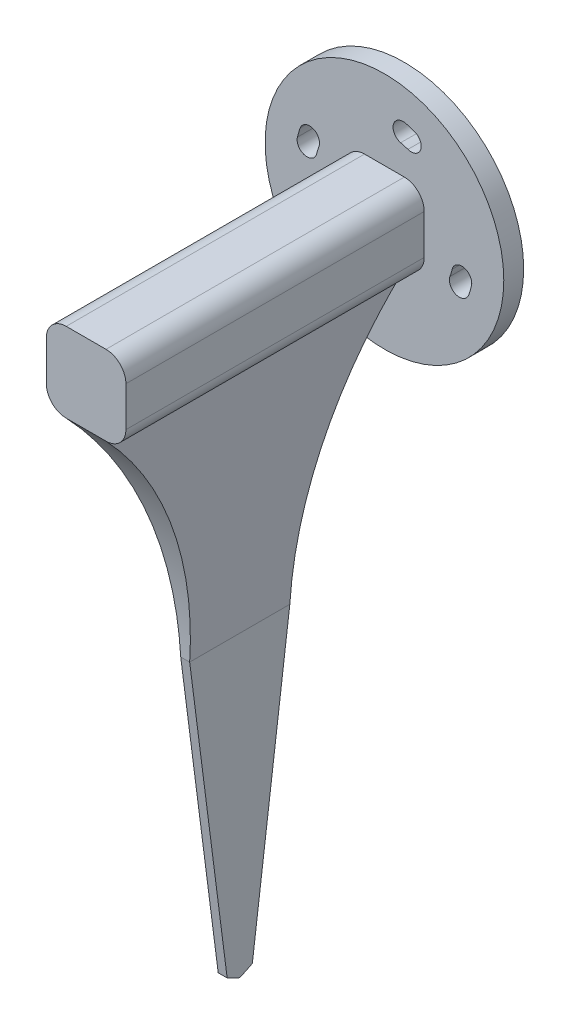
ISO-10303-21;
HEADER;
FILE_DESCRIPTION(('STEP AP214'),'2;1');
FILE_NAME('part.step','',(''),(''),'','','');
FILE_SCHEMA(('AUTOMOTIVE_DESIGN { 1 0 10303 214 1 1 1 1 }'));
ENDSEC;
DATA;
#1=APPLICATION_CONTEXT('core data for automotive mechanical design processes');
#2=APPLICATION_PROTOCOL_DEFINITION('international standard','automotive_design',2000,#1);
#3=PRODUCT_CONTEXT('',#1,'mechanical');
#4=PRODUCT('Part','Part','',(#3));
#5=PRODUCT_RELATED_PRODUCT_CATEGORY('part','',(#4));
#6=PRODUCT_DEFINITION_FORMATION('','',#4);
#7=PRODUCT_DEFINITION_CONTEXT('part definition',#1,'design');
#8=PRODUCT_DEFINITION('design','',#6,#7);
#9=PRODUCT_DEFINITION_SHAPE('','',#8);
#10=(LENGTH_UNIT() NAMED_UNIT(*) SI_UNIT(.MILLI.,.METRE.));
#11=(NAMED_UNIT(*) PLANE_ANGLE_UNIT() SI_UNIT($,.RADIAN.));
#12=(NAMED_UNIT(*) SI_UNIT($,.STERADIAN.) SOLID_ANGLE_UNIT());
#13=UNCERTAINTY_MEASURE_WITH_UNIT(LENGTH_MEASURE(1.E-05),#10,'distance_accuracy_value','');
#14=(GEOMETRIC_REPRESENTATION_CONTEXT(3) GLOBAL_UNCERTAINTY_ASSIGNED_CONTEXT((#13)) GLOBAL_UNIT_ASSIGNED_CONTEXT((#10,
#11,#12)) REPRESENTATION_CONTEXT('',''));
#15=CARTESIAN_POINT('',(0.,0.,0.));
#16=DIRECTION('',(0.,0.,1.));
#17=DIRECTION('',(1.,0.,0.));
#18=AXIS2_PLACEMENT_3D('',#15,#16,#17);
#19=CARTESIAN_POINT('',(0.,0.,2.));
#20=DIRECTION('',(0.,0.,1.));
#21=DIRECTION('',(1.,0.,0.));
#22=AXIS2_PLACEMENT_3D('',#19,#20,#21);
#23=PLANE('',#22);
#24=CARTESIAN_POINT('',(-2.69636700793075,-7.53190579857068,2.));
#25=DIRECTION('',(0.,0.,1.));
#26=DIRECTION('',(1.,0.,0.));
#27=AXIS2_PLACEMENT_3D('',#24,#25,#26);
#28=CIRCLE('',#27,0.999999999999998);
#29=CARTESIAN_POINT('',(-2.3593211319394,-6.59041757374934,2.));
#30=VERTEX_POINT('',#29);
#31=CARTESIAN_POINT('',(-3.0334128839221,-8.47339402339201,2.));
#32=VERTEX_POINT('',#31);
#33=EDGE_CURVE('E253',#30,#32,#28,.T.);
#34=ORIENTED_EDGE('',*,*,#33,.F.);
#35=CARTESIAN_POINT('',(0.,0.,2.));
#36=DIRECTION('',(0.,0.,1.));
#37=DIRECTION('',(1.,0.,0.));
#38=AXIS2_PLACEMENT_3D('',#35,#36,#37);
#39=CIRCLE('',#38,6.99999999999998);
#40=CARTESIAN_POINT('',(-1.63399074995166,-6.80661988281059,2.));
#41=VERTEX_POINT('',#40);
#42=EDGE_CURVE('E565',#30,#41,#39,.T.);
#43=ORIENTED_EDGE('',*,*,#42,.T.);
#44=CARTESIAN_POINT('',(-1.86741799994476,-7.77899415178353,2.));
#45=DIRECTION('',(0.,0.,1.));
#46=DIRECTION('',(1.,0.,0.));
#47=AXIS2_PLACEMENT_3D('',#44,#45,#46);
#48=CIRCLE('',#47,1.);
#49=CARTESIAN_POINT('',(-2.10084524993786,-8.75136842075647,2.));
#50=VERTEX_POINT('',#49);
#51=EDGE_CURVE('E561',#50,#41,#48,.T.);
#52=ORIENTED_EDGE('',*,*,#51,.F.);
#53=CARTESIAN_POINT('',(0.,0.,2.));
#54=DIRECTION('',(0.,0.,1.));
#55=DIRECTION('',(1.,0.,0.));
#56=AXIS2_PLACEMENT_3D('',#53,#54,#55);
#57=CIRCLE('',#56,8.99999999999997);
#58=EDGE_CURVE('E564',#32,#50,#57,.T.);
#59=ORIENTED_EDGE('',*,*,#58,.F.);
#60=EDGE_LOOP('',(#34,#43,#52,#59));
#61=FACE_BOUND('',#60,.T.);
#62=CARTESIAN_POINT('',(-7.53190579857068,2.69636700793075,2.));
#63=DIRECTION('',(0.,0.,1.));
#64=DIRECTION('',(1.,0.,0.));
#65=AXIS2_PLACEMENT_3D('',#62,#63,#64);
#66=CIRCLE('',#65,1.);
#67=CARTESIAN_POINT('',(-6.59041757374934,2.3593211319394,2.));
#68=VERTEX_POINT('',#67);
#69=CARTESIAN_POINT('',(-8.47339402339201,3.03341288392209,2.));
#70=VERTEX_POINT('',#69);
#71=EDGE_CURVE('E567',#68,#70,#66,.T.);
#72=ORIENTED_EDGE('',*,*,#71,.F.);
#73=CARTESIAN_POINT('',(0.,0.,2.));
#74=DIRECTION('',(0.,0.,1.));
#75=DIRECTION('',(1.,0.,0.));
#76=AXIS2_PLACEMENT_3D('',#73,#74,#75);
#77=CIRCLE('',#76,7.00000000000005);
#78=CARTESIAN_POINT('',(-6.80661988281061,1.63399074995159,2.));
#79=VERTEX_POINT('',#78);
#80=EDGE_CURVE('E574',#68,#79,#77,.T.);
#81=ORIENTED_EDGE('',*,*,#80,.T.);
#82=CARTESIAN_POINT('',(-7.77899415178355,1.86741799994468,2.));
#83=DIRECTION('',(0.,0.,1.));
#84=DIRECTION('',(1.,0.,0.));
#85=AXIS2_PLACEMENT_3D('',#82,#83,#84);
#86=CIRCLE('',#85,1.);
#87=CARTESIAN_POINT('',(-8.75136842075649,2.10084524993776,2.));
#88=VERTEX_POINT('',#87);
#89=EDGE_CURVE('E576',#88,#79,#86,.T.);
#90=ORIENTED_EDGE('',*,*,#89,.F.);
#91=CARTESIAN_POINT('',(0.,0.,2.));
#92=DIRECTION('',(0.,0.,1.));
#93=DIRECTION('',(1.,0.,0.));
#94=AXIS2_PLACEMENT_3D('',#91,#92,#93);
#95=CIRCLE('',#94,9.00000000000005);
#96=EDGE_CURVE('E579',#70,#88,#95,.T.);
#97=ORIENTED_EDGE('',*,*,#96,.F.);
#98=EDGE_LOOP('',(#72,#81,#90,#97));
#99=FACE_BOUND('',#98,.T.);
#100=CARTESIAN_POINT('',(2.69636700793075,7.53190579857068,2.));
#101=DIRECTION('',(0.,0.,1.));
#102=DIRECTION('',(1.,0.,0.));
#103=AXIS2_PLACEMENT_3D('',#100,#101,#102);
#104=CIRCLE('',#103,1.);
#105=CARTESIAN_POINT('',(2.3593211319394,6.59041757374935,2.));
#106=VERTEX_POINT('',#105);
#107=CARTESIAN_POINT('',(3.03341288392209,8.47339402339202,2.));
#108=VERTEX_POINT('',#107);
#109=EDGE_CURVE('E582',#106,#108,#104,.T.);
#110=ORIENTED_EDGE('',*,*,#109,.F.);
#111=CARTESIAN_POINT('',(0.,0.,2.));
#112=DIRECTION('',(0.,0.,1.));
#113=DIRECTION('',(1.,0.,0.));
#114=AXIS2_PLACEMENT_3D('',#111,#112,#113);
#115=CIRCLE('',#114,7.00000000000002);
#116=CARTESIAN_POINT('',(1.63399074995162,6.8066198828106,2.));
#117=VERTEX_POINT('',#116);
#118=EDGE_CURVE('E585',#106,#117,#115,.T.);
#119=ORIENTED_EDGE('',*,*,#118,.T.);
#120=CARTESIAN_POINT('',(1.8674179999447,7.77899415178354,2.));
#121=DIRECTION('',(0.,0.,1.));
#122=DIRECTION('',(1.,0.,0.));
#123=AXIS2_PLACEMENT_3D('',#120,#121,#122);
#124=CIRCLE('',#123,1.);
#125=CARTESIAN_POINT('',(2.10084524993779,8.75136842075649,2.));
#126=VERTEX_POINT('',#125);
#127=EDGE_CURVE('E587',#126,#117,#124,.T.);
#128=ORIENTED_EDGE('',*,*,#127,.F.);
#129=CARTESIAN_POINT('',(0.,0.,2.));
#130=DIRECTION('',(0.,0.,1.));
#131=DIRECTION('',(1.,0.,0.));
#132=AXIS2_PLACEMENT_3D('',#129,#130,#131);
#133=CIRCLE('',#132,9.00000000000003);
#134=EDGE_CURVE('E590',#108,#126,#133,.T.);
#135=ORIENTED_EDGE('',*,*,#134,.F.);
#136=EDGE_LOOP('',(#110,#119,#128,#135));
#137=FACE_BOUND('',#136,.T.);
#138=CARTESIAN_POINT('',(0.,0.,2.));
#139=DIRECTION('',(0.,0.,1.));
#140=DIRECTION('',(1.,0.,0.));
#141=AXIS2_PLACEMENT_3D('',#138,#139,#140);
#142=CIRCLE('',#141,6.99999999999996);
#143=CARTESIAN_POINT('',(6.59041757374934,-2.35932113193941,2.));
#144=VERTEX_POINT('',#143);
#145=CARTESIAN_POINT('',(6.80661988281059,-1.63399074995164,2.));
#146=VERTEX_POINT('',#145);
#147=EDGE_CURVE('E192',#144,#146,#142,.T.);
#148=ORIENTED_EDGE('',*,*,#147,.T.);
#149=CARTESIAN_POINT('',(7.77899415178354,-1.86741799994473,2.));
#150=DIRECTION('',(0.,0.,1.));
#151=DIRECTION('',(1.,0.,0.));
#152=AXIS2_PLACEMENT_3D('',#149,#150,#151);
#153=CIRCLE('',#152,1.);
#154=CARTESIAN_POINT('',(8.75136842075648,-2.10084524993783,2.));
#155=VERTEX_POINT('',#154);
#156=EDGE_CURVE('E178',#155,#146,#153,.T.);
#157=ORIENTED_EDGE('',*,*,#156,.F.);
#158=CARTESIAN_POINT('',(0.,0.,2.));
#159=DIRECTION('',(0.,0.,1.));
#160=DIRECTION('',(1.,0.,0.));
#161=AXIS2_PLACEMENT_3D('',#158,#159,#160);
#162=CIRCLE('',#161,8.99999999999996);
#163=CARTESIAN_POINT('',(8.47339402339202,-3.03341288392209,2.));
#164=VERTEX_POINT('',#163);
#165=EDGE_CURVE('E191',#164,#155,#162,.T.);
#166=ORIENTED_EDGE('',*,*,#165,.F.);
#167=CARTESIAN_POINT('',(7.53190579857068,-2.69636700793075,2.));
#168=DIRECTION('',(0.,0.,1.));
#169=DIRECTION('',(1.,0.,0.));
#170=AXIS2_PLACEMENT_3D('',#167,#168,#169);
#171=CIRCLE('',#170,1.);
#172=EDGE_CURVE('E196',#144,#164,#171,.T.);
#173=ORIENTED_EDGE('',*,*,#172,.F.);
#174=EDGE_LOOP('',(#148,#157,#166,#173));
#175=FACE_BOUND('',#174,.T.);
#176=CARTESIAN_POINT('',(0.,0.,2.));
#177=DIRECTION('',(0.,0.,1.));
#178=DIRECTION('',(1.,0.,0.));
#179=AXIS2_PLACEMENT_3D('',#176,#177,#178);
#180=CIRCLE('',#179,12.);
#181=CARTESIAN_POINT('',(12.,0.,2.));
#182=VERTEX_POINT('',#181);
#183=EDGE_CURVE('E198',#182,#182,#180,.T.);
#184=ORIENTED_EDGE('',*,*,#183,.T.);
#185=EDGE_LOOP('',(#184));
#186=FACE_BOUND('',#185,.T.);
#187=DIRECTION('',(1.,0.,0.));
#188=VECTOR('',#187,1.);
#189=CARTESIAN_POINT('',(0.,-4.,2.));
#190=LINE('',#189,#188);
#191=CARTESIAN_POINT('',(-2.,-4.,2.));
#192=VERTEX_POINT('',#191);
#193=CARTESIAN_POINT('',(2.,-4.,2.));
#194=VERTEX_POINT('',#193);
#195=EDGE_CURVE('E290',#192,#194,#190,.T.);
#196=ORIENTED_EDGE('',*,*,#195,.F.);
#197=CARTESIAN_POINT('',(-2.,-2.,2.));
#198=DIRECTION('',(0.,0.,1.));
#199=DIRECTION('',(1.,0.,0.));
#200=AXIS2_PLACEMENT_3D('',#197,#198,#199);
#201=CIRCLE('',#200,2.);
#202=CARTESIAN_POINT('',(-4.,-2.,2.));
#203=VERTEX_POINT('',#202);
#204=EDGE_CURVE('E287',#203,#192,#201,.T.);
#205=ORIENTED_EDGE('',*,*,#204,.F.);
#206=DIRECTION('',(0.,-1.,0.));
#207=VECTOR('',#206,1.);
#208=CARTESIAN_POINT('',(-4.,2.,2.));
#209=LINE('',#208,#207);
#210=CARTESIAN_POINT('',(-4.,2.,2.));
#211=VERTEX_POINT('',#210);
#212=EDGE_CURVE('E286',#211,#203,#209,.T.);
#213=ORIENTED_EDGE('',*,*,#212,.F.);
#214=CARTESIAN_POINT('',(-2.,2.,2.));
#215=DIRECTION('',(0.,0.,1.));
#216=DIRECTION('',(1.,0.,0.));
#217=AXIS2_PLACEMENT_3D('',#214,#215,#216);
#218=CIRCLE('',#217,2.);
#219=CARTESIAN_POINT('',(-2.,4.,2.));
#220=VERTEX_POINT('',#219);
#221=EDGE_CURVE('E635',#220,#211,#218,.T.);
#222=ORIENTED_EDGE('',*,*,#221,.F.);
#223=DIRECTION('',(-1.,0.,0.));
#224=VECTOR('',#223,1.);
#225=CARTESIAN_POINT('',(-2.,4.,2.));
#226=LINE('',#225,#224);
#227=CARTESIAN_POINT('',(2.,4.,2.));
#228=VERTEX_POINT('',#227);
#229=EDGE_CURVE('E637',#228,#220,#226,.T.);
#230=ORIENTED_EDGE('',*,*,#229,.F.);
#231=CARTESIAN_POINT('',(2.,2.,2.));
#232=DIRECTION('',(0.,0.,1.));
#233=DIRECTION('',(-1.,0.,0.));
#234=AXIS2_PLACEMENT_3D('',#231,#232,#233);
#235=CIRCLE('',#234,2.);
#236=CARTESIAN_POINT('',(4.,2.,2.));
#237=VERTEX_POINT('',#236);
#238=EDGE_CURVE('E640',#237,#228,#235,.T.);
#239=ORIENTED_EDGE('',*,*,#238,.F.);
#240=DIRECTION('',(0.,1.,0.));
#241=VECTOR('',#240,1.);
#242=CARTESIAN_POINT('',(4.,2.,2.));
#243=LINE('',#242,#241);
#244=CARTESIAN_POINT('',(4.,-2.,2.));
#245=VERTEX_POINT('',#244);
#246=EDGE_CURVE('E295',#245,#237,#243,.T.);
#247=ORIENTED_EDGE('',*,*,#246,.F.);
#248=CARTESIAN_POINT('',(2.,-2.,2.));
#249=DIRECTION('',(0.,0.,1.));
#250=DIRECTION('',(1.,0.,0.));
#251=AXIS2_PLACEMENT_3D('',#248,#249,#250);
#252=CIRCLE('',#251,2.);
#253=EDGE_CURVE('E292',#194,#245,#252,.T.);
#254=ORIENTED_EDGE('',*,*,#253,.F.);
#255=EDGE_LOOP('',(#196,#205,#213,#222,#230,#239,#247,#254));
#256=FACE_BOUND('',#255,.T.);
#257=ADVANCED_FACE('F43',(#61,#99,#137,#175,#186,#256),#23,.T.);
#258=CARTESIAN_POINT('',(0.,0.,2.));
#259=DIRECTION('',(0.,0.,-1.));
#260=DIRECTION('',(-1.,0.,0.));
#261=AXIS2_PLACEMENT_3D('',#258,#259,#260);
#262=CYLINDRICAL_SURFACE('',#261,6.99999999999996);
#263=CARTESIAN_POINT('',(0.,0.,0.));
#264=DIRECTION('',(0.,0.,1.));
#265=DIRECTION('',(1.,0.,0.));
#266=AXIS2_PLACEMENT_3D('',#263,#264,#265);
#267=CIRCLE('',#266,6.99999999999996);
#268=CARTESIAN_POINT('',(6.59041757374934,-2.35932113193941,0.));
#269=VERTEX_POINT('',#268);
#270=CARTESIAN_POINT('',(6.80661988281059,-1.63399074995164,0.));
#271=VERTEX_POINT('',#270);
#272=EDGE_CURVE('E242',#269,#271,#267,.T.);
#273=ORIENTED_EDGE('',*,*,#272,.T.);
#274=DIRECTION('',(0.,0.,-1.));
#275=VECTOR('',#274,1.);
#276=CARTESIAN_POINT('',(6.80661988281059,-1.63399074995164,2.));
#277=LINE('',#276,#275);
#278=EDGE_CURVE('E12',#146,#271,#277,.T.);
#279=ORIENTED_EDGE('',*,*,#278,.F.);
#280=ORIENTED_EDGE('',*,*,#147,.F.);
#281=DIRECTION('',(0.,0.,-1.));
#282=VECTOR('',#281,1.);
#283=CARTESIAN_POINT('',(6.59041757374934,-2.35932113193941,2.));
#284=LINE('',#283,#282);
#285=EDGE_CURVE('E70',#144,#269,#284,.T.);
#286=ORIENTED_EDGE('',*,*,#285,.T.);
#287=EDGE_LOOP('',(#273,#279,#280,#286));
#288=FACE_BOUND('',#287,.T.);
#289=ADVANCED_FACE('F491',(#288),#262,.T.);
#290=CARTESIAN_POINT('',(7.77899415178354,-1.86741799994473,2.));
#291=DIRECTION('',(0.,0.,-1.));
#292=DIRECTION('',(-1.,0.,0.));
#293=AXIS2_PLACEMENT_3D('',#290,#291,#292);
#294=CYLINDRICAL_SURFACE('',#293,1.);
#295=CARTESIAN_POINT('',(7.77899415178354,-1.86741799994473,0.));
#296=DIRECTION('',(0.,0.,1.));
#297=DIRECTION('',(1.,0.,0.));
#298=AXIS2_PLACEMENT_3D('',#295,#296,#297);
#299=CIRCLE('',#298,1.);
#300=CARTESIAN_POINT('',(8.75136842075648,-2.10084524993783,0.));
#301=VERTEX_POINT('',#300);
#302=EDGE_CURVE('E180',#301,#271,#299,.T.);
#303=ORIENTED_EDGE('',*,*,#302,.F.);
#304=DIRECTION('',(0.,0.,-1.));
#305=VECTOR('',#304,1.);
#306=CARTESIAN_POINT('',(8.75136842075648,-2.10084524993783,2.));
#307=LINE('',#306,#305);
#308=EDGE_CURVE('E53',#155,#301,#307,.T.);
#309=ORIENTED_EDGE('',*,*,#308,.F.);
#310=ORIENTED_EDGE('',*,*,#156,.T.);
#311=ORIENTED_EDGE('',*,*,#278,.T.);
#312=EDGE_LOOP('',(#303,#309,#310,#311));
#313=FACE_BOUND('',#312,.T.);
#314=ADVANCED_FACE('F177',(#313),#294,.F.);
#315=CARTESIAN_POINT('',(0.,0.,2.));
#316=DIRECTION('',(0.,0.,-1.));
#317=DIRECTION('',(-1.,0.,0.));
#318=AXIS2_PLACEMENT_3D('',#315,#316,#317);
#319=CYLINDRICAL_SURFACE('',#318,8.99999999999996);
#320=CARTESIAN_POINT('',(0.,0.,0.));
#321=DIRECTION('',(0.,0.,1.));
#322=DIRECTION('',(1.,0.,0.));
#323=AXIS2_PLACEMENT_3D('',#320,#321,#322);
#324=CIRCLE('',#323,8.99999999999996);
#325=CARTESIAN_POINT('',(8.47339402339202,-3.03341288392209,0.));
#326=VERTEX_POINT('',#325);
#327=EDGE_CURVE('E245',#326,#301,#324,.T.);
#328=ORIENTED_EDGE('',*,*,#327,.F.);
#329=DIRECTION('',(0.,0.,-1.));
#330=VECTOR('',#329,1.);
#331=CARTESIAN_POINT('',(8.47339402339202,-3.03341288392209,2.));
#332=LINE('',#331,#330);
#333=EDGE_CURVE('E185',#164,#326,#332,.T.);
#334=ORIENTED_EDGE('',*,*,#333,.F.);
#335=ORIENTED_EDGE('',*,*,#165,.T.);
#336=ORIENTED_EDGE('',*,*,#308,.T.);
#337=EDGE_LOOP('',(#328,#334,#335,#336));
#338=FACE_BOUND('',#337,.T.);
#339=ADVANCED_FACE('F195',(#338),#319,.F.);
#340=CARTESIAN_POINT('',(2.69636700793075,7.53190579857068,2.));
#341=DIRECTION('',(0.,0.,-1.));
#342=DIRECTION('',(-1.,0.,0.));
#343=AXIS2_PLACEMENT_3D('',#340,#341,#342);
#344=CYLINDRICAL_SURFACE('',#343,1.);
#345=CARTESIAN_POINT('',(2.69636700793075,7.53190579857068,0.));
#346=DIRECTION('',(0.,0.,1.));
#347=DIRECTION('',(1.,0.,0.));
#348=AXIS2_PLACEMENT_3D('',#345,#346,#347);
#349=CIRCLE('',#348,1.);
#350=CARTESIAN_POINT('',(2.3593211319394,6.59041757374935,0.));
#351=VERTEX_POINT('',#350);
#352=CARTESIAN_POINT('',(3.03341288392209,8.47339402339202,0.));
#353=VERTEX_POINT('',#352);
#354=EDGE_CURVE('E230',#351,#353,#349,.T.);
#355=ORIENTED_EDGE('',*,*,#354,.F.);
#356=DIRECTION('',(0.,0.,-1.));
#357=VECTOR('',#356,1.);
#358=CARTESIAN_POINT('',(2.3593211319394,6.59041757374935,2.));
#359=LINE('',#358,#357);
#360=EDGE_CURVE('E255',#106,#351,#359,.T.);
#361=ORIENTED_EDGE('',*,*,#360,.F.);
#362=ORIENTED_EDGE('',*,*,#109,.T.);
#363=DIRECTION('',(0.,0.,-1.));
#364=VECTOR('',#363,1.);
#365=CARTESIAN_POINT('',(3.03341288392209,8.47339402339202,2.));
#366=LINE('',#365,#364);
#367=EDGE_CURVE('E257',#108,#353,#366,.T.);
#368=ORIENTED_EDGE('',*,*,#367,.T.);
#369=EDGE_LOOP('',(#355,#361,#362,#368));
#370=FACE_BOUND('',#369,.T.);
#371=ADVANCED_FACE('F508',(#370),#344,.F.);
#372=CARTESIAN_POINT('',(0.,0.,2.));
#373=DIRECTION('',(0.,0.,-1.));
#374=DIRECTION('',(-1.,0.,0.));
#375=AXIS2_PLACEMENT_3D('',#372,#373,#374);
#376=CYLINDRICAL_SURFACE('',#375,7.00000000000002);
#377=CARTESIAN_POINT('',(0.,0.,0.));
#378=DIRECTION('',(0.,0.,1.));
#379=DIRECTION('',(1.,0.,0.));
#380=AXIS2_PLACEMENT_3D('',#377,#378,#379);
#381=CIRCLE('',#380,7.00000000000002);
#382=CARTESIAN_POINT('',(1.63399074995162,6.8066198828106,0.));
#383=VERTEX_POINT('',#382);
#384=EDGE_CURVE('E233',#351,#383,#381,.T.);
#385=ORIENTED_EDGE('',*,*,#384,.T.);
#386=DIRECTION('',(0.,0.,-1.));
#387=VECTOR('',#386,1.);
#388=CARTESIAN_POINT('',(1.63399074995162,6.8066198828106,2.));
#389=LINE('',#388,#387);
#390=EDGE_CURVE('E262',#117,#383,#389,.T.);
#391=ORIENTED_EDGE('',*,*,#390,.F.);
#392=ORIENTED_EDGE('',*,*,#118,.F.);
#393=ORIENTED_EDGE('',*,*,#360,.T.);
#394=EDGE_LOOP('',(#385,#391,#392,#393));
#395=FACE_BOUND('',#394,.T.);
#396=ADVANCED_FACE('F521',(#395),#376,.T.);
#397=CARTESIAN_POINT('',(1.8674179999447,7.77899415178354,2.));
#398=DIRECTION('',(0.,0.,-1.));
#399=DIRECTION('',(-1.,0.,0.));
#400=AXIS2_PLACEMENT_3D('',#397,#398,#399);
#401=CYLINDRICAL_SURFACE('',#400,1.);
#402=CARTESIAN_POINT('',(1.8674179999447,7.77899415178354,0.));
#403=DIRECTION('',(0.,0.,1.));
#404=DIRECTION('',(1.,0.,0.));
#405=AXIS2_PLACEMENT_3D('',#402,#403,#404);
#406=CIRCLE('',#405,1.);
#407=CARTESIAN_POINT('',(2.10084524993779,8.75136842075649,0.));
#408=VERTEX_POINT('',#407);
#409=EDGE_CURVE('E236',#408,#383,#406,.T.);
#410=ORIENTED_EDGE('',*,*,#409,.F.);
#411=DIRECTION('',(0.,0.,-1.));
#412=VECTOR('',#411,1.);
#413=CARTESIAN_POINT('',(2.10084524993779,8.75136842075649,2.));
#414=LINE('',#413,#412);
#415=EDGE_CURVE('E259',#126,#408,#414,.T.);
#416=ORIENTED_EDGE('',*,*,#415,.F.);
#417=ORIENTED_EDGE('',*,*,#127,.T.);
#418=ORIENTED_EDGE('',*,*,#390,.T.);
#419=EDGE_LOOP('',(#410,#416,#417,#418));
#420=FACE_BOUND('',#419,.T.);
#421=ADVANCED_FACE('F517',(#420),#401,.F.);
#422=CARTESIAN_POINT('',(-7.53190579857068,2.69636700793075,2.));
#423=DIRECTION('',(0.,0.,-1.));
#424=DIRECTION('',(-1.,0.,0.));
#425=AXIS2_PLACEMENT_3D('',#422,#423,#424);
#426=CYLINDRICAL_SURFACE('',#425,1.);
#427=CARTESIAN_POINT('',(-7.53190579857068,2.69636700793075,0.));
#428=DIRECTION('',(0.,0.,1.));
#429=DIRECTION('',(1.,0.,0.));
#430=AXIS2_PLACEMENT_3D('',#427,#428,#429);
#431=CIRCLE('',#430,1.);
#432=CARTESIAN_POINT('',(-6.59041757374934,2.3593211319394,0.));
#433=VERTEX_POINT('',#432);
#434=CARTESIAN_POINT('',(-8.47339402339201,3.03341288392209,0.));
#435=VERTEX_POINT('',#434);
#436=EDGE_CURVE('E218',#433,#435,#431,.T.);
#437=ORIENTED_EDGE('',*,*,#436,.F.);
#438=DIRECTION('',(0.,0.,-1.));
#439=VECTOR('',#438,1.);
#440=CARTESIAN_POINT('',(-6.59041757374934,2.3593211319394,2.));
#441=LINE('',#440,#439);
#442=EDGE_CURVE('E260',#68,#433,#441,.T.);
#443=ORIENTED_EDGE('',*,*,#442,.F.);
#444=ORIENTED_EDGE('',*,*,#71,.T.);
#445=DIRECTION('',(0.,0.,-1.));
#446=VECTOR('',#445,1.);
#447=CARTESIAN_POINT('',(-8.47339402339201,3.03341288392209,2.));
#448=LINE('',#447,#446);
#449=EDGE_CURVE('E265',#70,#435,#448,.T.);
#450=ORIENTED_EDGE('',*,*,#449,.T.);
#451=EDGE_LOOP('',(#437,#443,#444,#450));
#452=FACE_BOUND('',#451,.T.);
#453=ADVANCED_FACE('F520',(#452),#426,.F.);
#454=CARTESIAN_POINT('',(0.,0.,2.));
#455=DIRECTION('',(0.,0.,-1.));
#456=DIRECTION('',(-1.,0.,0.));
#457=AXIS2_PLACEMENT_3D('',#454,#455,#456);
#458=CYLINDRICAL_SURFACE('',#457,7.00000000000005);
#459=CARTESIAN_POINT('',(0.,0.,0.));
#460=DIRECTION('',(0.,0.,1.));
#461=DIRECTION('',(1.,0.,0.));
#462=AXIS2_PLACEMENT_3D('',#459,#460,#461);
#463=CIRCLE('',#462,7.00000000000005);
#464=CARTESIAN_POINT('',(-6.80661988281061,1.63399074995159,0.));
#465=VERTEX_POINT('',#464);
#466=EDGE_CURVE('E221',#433,#465,#463,.T.);
#467=ORIENTED_EDGE('',*,*,#466,.T.);
#468=DIRECTION('',(0.,0.,-1.));
#469=VECTOR('',#468,1.);
#470=CARTESIAN_POINT('',(-6.80661988281061,1.63399074995159,2.));
#471=LINE('',#470,#469);
#472=EDGE_CURVE('E269',#79,#465,#471,.T.);
#473=ORIENTED_EDGE('',*,*,#472,.F.);
#474=ORIENTED_EDGE('',*,*,#80,.F.);
#475=ORIENTED_EDGE('',*,*,#442,.T.);
#476=EDGE_LOOP('',(#467,#473,#474,#475));
#477=FACE_BOUND('',#476,.T.);
#478=ADVANCED_FACE('F535',(#477),#458,.T.);
#479=CARTESIAN_POINT('',(-7.77899415178355,1.86741799994468,2.));
#480=DIRECTION('',(0.,0.,-1.));
#481=DIRECTION('',(-1.,0.,0.));
#482=AXIS2_PLACEMENT_3D('',#479,#480,#481);
#483=CYLINDRICAL_SURFACE('',#482,1.);
#484=CARTESIAN_POINT('',(-7.77899415178355,1.86741799994468,0.));
#485=DIRECTION('',(0.,0.,1.));
#486=DIRECTION('',(1.,0.,0.));
#487=AXIS2_PLACEMENT_3D('',#484,#485,#486);
#488=CIRCLE('',#487,1.);
#489=CARTESIAN_POINT('',(-8.75136842075649,2.10084524993776,0.));
#490=VERTEX_POINT('',#489);
#491=EDGE_CURVE('E224',#490,#465,#488,.T.);
#492=ORIENTED_EDGE('',*,*,#491,.F.);
#493=DIRECTION('',(0.,0.,-1.));
#494=VECTOR('',#493,1.);
#495=CARTESIAN_POINT('',(-8.75136842075649,2.10084524993776,2.));
#496=LINE('',#495,#494);
#497=EDGE_CURVE('E267',#88,#490,#496,.T.);
#498=ORIENTED_EDGE('',*,*,#497,.F.);
#499=ORIENTED_EDGE('',*,*,#89,.T.);
#500=ORIENTED_EDGE('',*,*,#472,.T.);
#501=EDGE_LOOP('',(#492,#498,#499,#500));
#502=FACE_BOUND('',#501,.T.);
#503=ADVANCED_FACE('F532',(#502),#483,.F.);
#504=CARTESIAN_POINT('',(-2.69636700793075,-7.53190579857068,2.));
#505=DIRECTION('',(0.,0.,-1.));
#506=DIRECTION('',(-1.,0.,0.));
#507=AXIS2_PLACEMENT_3D('',#504,#505,#506);
#508=CYLINDRICAL_SURFACE('',#507,0.999999999999998);
#509=CARTESIAN_POINT('',(-2.69636700793075,-7.53190579857068,0.));
#510=DIRECTION('',(0.,0.,1.));
#511=DIRECTION('',(1.,0.,0.));
#512=AXIS2_PLACEMENT_3D('',#509,#510,#511);
#513=CIRCLE('',#512,0.999999999999998);
#514=CARTESIAN_POINT('',(-2.3593211319394,-6.59041757374934,0.));
#515=VERTEX_POINT('',#514);
#516=CARTESIAN_POINT('',(-3.0334128839221,-8.47339402339201,0.));
#517=VERTEX_POINT('',#516);
#518=EDGE_CURVE('E205',#515,#517,#513,.T.);
#519=ORIENTED_EDGE('',*,*,#518,.F.);
#520=DIRECTION('',(0.,0.,-1.));
#521=VECTOR('',#520,1.);
#522=CARTESIAN_POINT('',(-2.3593211319394,-6.59041757374934,2.));
#523=LINE('',#522,#521);
#524=EDGE_CURVE('E132',#30,#515,#523,.T.);
#525=ORIENTED_EDGE('',*,*,#524,.F.);
#526=ORIENTED_EDGE('',*,*,#33,.T.);
#527=DIRECTION('',(0.,0.,-1.));
#528=VECTOR('',#527,1.);
#529=CARTESIAN_POINT('',(-3.0334128839221,-8.47339402339201,2.));
#530=LINE('',#529,#528);
#531=EDGE_CURVE('E204',#32,#517,#530,.T.);
#532=ORIENTED_EDGE('',*,*,#531,.T.);
#533=EDGE_LOOP('',(#519,#525,#526,#532));
#534=FACE_BOUND('',#533,.T.);
#535=ADVANCED_FACE('F45',(#534),#508,.F.);
#536=CARTESIAN_POINT('',(0.,0.,2.));
#537=DIRECTION('',(0.,0.,-1.));
#538=DIRECTION('',(-1.,0.,0.));
#539=AXIS2_PLACEMENT_3D('',#536,#537,#538);
#540=CYLINDRICAL_SURFACE('',#539,6.99999999999998);
#541=CARTESIAN_POINT('',(0.,0.,0.));
#542=DIRECTION('',(0.,0.,1.));
#543=DIRECTION('',(1.,0.,0.));
#544=AXIS2_PLACEMENT_3D('',#541,#542,#543);
#545=CIRCLE('',#544,6.99999999999998);
#546=CARTESIAN_POINT('',(-1.63399074995166,-6.80661988281059,0.));
#547=VERTEX_POINT('',#546);
#548=EDGE_CURVE('E208',#515,#547,#545,.T.);
#549=ORIENTED_EDGE('',*,*,#548,.T.);
#550=DIRECTION('',(0.,0.,-1.));
#551=VECTOR('',#550,1.);
#552=CARTESIAN_POINT('',(-1.63399074995166,-6.80661988281059,2.));
#553=LINE('',#552,#551);
#554=EDGE_CURVE('E275',#41,#547,#553,.T.);
#555=ORIENTED_EDGE('',*,*,#554,.F.);
#556=ORIENTED_EDGE('',*,*,#42,.F.);
#557=ORIENTED_EDGE('',*,*,#524,.T.);
#558=EDGE_LOOP('',(#549,#555,#556,#557));
#559=FACE_BOUND('',#558,.T.);
#560=ADVANCED_FACE('F547',(#559),#540,.T.);
#561=CARTESIAN_POINT('',(-1.86741799994476,-7.77899415178353,2.));
#562=DIRECTION('',(0.,0.,-1.));
#563=DIRECTION('',(-1.,0.,0.));
#564=AXIS2_PLACEMENT_3D('',#561,#562,#563);
#565=CYLINDRICAL_SURFACE('',#564,1.);
#566=CARTESIAN_POINT('',(-1.86741799994476,-7.77899415178353,0.));
#567=DIRECTION('',(0.,0.,1.));
#568=DIRECTION('',(1.,0.,0.));
#569=AXIS2_PLACEMENT_3D('',#566,#567,#568);
#570=CIRCLE('',#569,1.);
#571=CARTESIAN_POINT('',(-2.10084524993786,-8.75136842075647,0.));
#572=VERTEX_POINT('',#571);
#573=EDGE_CURVE('E212',#572,#547,#570,.T.);
#574=ORIENTED_EDGE('',*,*,#573,.F.);
#575=DIRECTION('',(0.,0.,-1.));
#576=VECTOR('',#575,1.);
#577=CARTESIAN_POINT('',(-2.10084524993786,-8.75136842075647,2.));
#578=LINE('',#577,#576);
#579=EDGE_CURVE('E273',#50,#572,#578,.T.);
#580=ORIENTED_EDGE('',*,*,#579,.F.);
#581=ORIENTED_EDGE('',*,*,#51,.T.);
#582=ORIENTED_EDGE('',*,*,#554,.T.);
#583=EDGE_LOOP('',(#574,#580,#581,#582));
#584=FACE_BOUND('',#583,.T.);
#585=ADVANCED_FACE('F505',(#584),#565,.F.);
#586=CARTESIAN_POINT('',(7.53190579857068,-2.69636700793075,2.));
#587=DIRECTION('',(0.,0.,-1.));
#588=DIRECTION('',(-1.,0.,0.));
#589=AXIS2_PLACEMENT_3D('',#586,#587,#588);
#590=CYLINDRICAL_SURFACE('',#589,1.);
#591=CARTESIAN_POINT('',(7.53190579857068,-2.69636700793075,0.));
#592=DIRECTION('',(0.,0.,1.));
#593=DIRECTION('',(1.,0.,0.));
#594=AXIS2_PLACEMENT_3D('',#591,#592,#593);
#595=CIRCLE('',#594,1.);
#596=EDGE_CURVE('E247',#269,#326,#595,.T.);
#597=ORIENTED_EDGE('',*,*,#596,.F.);
#598=ORIENTED_EDGE('',*,*,#285,.F.);
#599=ORIENTED_EDGE('',*,*,#172,.T.);
#600=ORIENTED_EDGE('',*,*,#333,.T.);
#601=EDGE_LOOP('',(#597,#598,#599,#600));
#602=FACE_BOUND('',#601,.T.);
#603=ADVANCED_FACE('F501',(#602),#590,.F.);
#604=CARTESIAN_POINT('',(0.,0.,2.));
#605=DIRECTION('',(0.,0.,-1.));
#606=DIRECTION('',(-1.,0.,0.));
#607=AXIS2_PLACEMENT_3D('',#604,#605,#606);
#608=CYLINDRICAL_SURFACE('',#607,9.00000000000003);
#609=CARTESIAN_POINT('',(0.,0.,0.));
#610=DIRECTION('',(0.,0.,1.));
#611=DIRECTION('',(1.,0.,0.));
#612=AXIS2_PLACEMENT_3D('',#609,#610,#611);
#613=CIRCLE('',#612,9.00000000000003);
#614=EDGE_CURVE('E239',#353,#408,#613,.T.);
#615=ORIENTED_EDGE('',*,*,#614,.F.);
#616=ORIENTED_EDGE('',*,*,#367,.F.);
#617=ORIENTED_EDGE('',*,*,#134,.T.);
#618=ORIENTED_EDGE('',*,*,#415,.T.);
#619=EDGE_LOOP('',(#615,#616,#617,#618));
#620=FACE_BOUND('',#619,.T.);
#621=ADVANCED_FACE('F504',(#620),#608,.F.);
#622=CARTESIAN_POINT('',(0.,0.,2.));
#623=DIRECTION('',(0.,0.,-1.));
#624=DIRECTION('',(-1.,0.,0.));
#625=AXIS2_PLACEMENT_3D('',#622,#623,#624);
#626=CYLINDRICAL_SURFACE('',#625,9.00000000000005);
#627=CARTESIAN_POINT('',(0.,0.,0.));
#628=DIRECTION('',(0.,0.,1.));
#629=DIRECTION('',(1.,0.,0.));
#630=AXIS2_PLACEMENT_3D('',#627,#628,#629);
#631=CIRCLE('',#630,9.00000000000005);
#632=EDGE_CURVE('E227',#435,#490,#631,.T.);
#633=ORIENTED_EDGE('',*,*,#632,.F.);
#634=ORIENTED_EDGE('',*,*,#449,.F.);
#635=ORIENTED_EDGE('',*,*,#96,.T.);
#636=ORIENTED_EDGE('',*,*,#497,.T.);
#637=EDGE_LOOP('',(#633,#634,#635,#636));
#638=FACE_BOUND('',#637,.T.);
#639=ADVANCED_FACE('F515',(#638),#626,.F.);
#640=CARTESIAN_POINT('',(0.,0.,2.));
#641=DIRECTION('',(0.,0.,-1.));
#642=DIRECTION('',(-1.,0.,0.));
#643=AXIS2_PLACEMENT_3D('',#640,#641,#642);
#644=CYLINDRICAL_SURFACE('',#643,8.99999999999997);
#645=CARTESIAN_POINT('',(0.,0.,0.));
#646=DIRECTION('',(0.,0.,1.));
#647=DIRECTION('',(1.,0.,0.));
#648=AXIS2_PLACEMENT_3D('',#645,#646,#647);
#649=CIRCLE('',#648,8.99999999999997);
#650=EDGE_CURVE('E215',#517,#572,#649,.T.);
#651=ORIENTED_EDGE('',*,*,#650,.F.);
#652=ORIENTED_EDGE('',*,*,#531,.F.);
#653=ORIENTED_EDGE('',*,*,#58,.T.);
#654=ORIENTED_EDGE('',*,*,#579,.T.);
#655=EDGE_LOOP('',(#651,#652,#653,#654));
#656=FACE_BOUND('',#655,.T.);
#657=ADVANCED_FACE('F499',(#656),#644,.F.);
#658=CARTESIAN_POINT('',(0.,0.,2.));
#659=DIRECTION('',(0.,0.,-1.));
#660=DIRECTION('',(-1.,0.,0.));
#661=AXIS2_PLACEMENT_3D('',#658,#659,#660);
#662=CYLINDRICAL_SURFACE('',#661,12.);
#663=ORIENTED_EDGE('',*,*,#183,.F.);
#664=EDGE_LOOP('',(#663));
#665=FACE_BOUND('',#664,.T.);
#666=CARTESIAN_POINT('',(0.,0.,0.));
#667=DIRECTION('',(0.,0.,1.));
#668=DIRECTION('',(1.,0.,0.));
#669=AXIS2_PLACEMENT_3D('',#666,#667,#668);
#670=CIRCLE('',#669,12.);
#671=CARTESIAN_POINT('',(12.,0.,0.));
#672=VERTEX_POINT('',#671);
#673=EDGE_CURVE('E250',#672,#672,#670,.T.);
#674=ORIENTED_EDGE('',*,*,#673,.T.);
#675=EDGE_LOOP('',(#674));
#676=FACE_BOUND('',#675,.T.);
#677=ADVANCED_FACE('F495',(#665,#676),#662,.T.);
#678=CARTESIAN_POINT('',(0.,0.,0.));
#679=DIRECTION('',(0.,0.,1.));
#680=DIRECTION('',(1.,0.,0.));
#681=AXIS2_PLACEMENT_3D('',#678,#679,#680);
#682=PLANE('',#681);
#683=ORIENTED_EDGE('',*,*,#518,.T.);
#684=ORIENTED_EDGE('',*,*,#650,.T.);
#685=ORIENTED_EDGE('',*,*,#573,.T.);
#686=ORIENTED_EDGE('',*,*,#548,.F.);
#687=EDGE_LOOP('',(#683,#684,#685,#686));
#688=FACE_BOUND('',#687,.T.);
#689=ORIENTED_EDGE('',*,*,#436,.T.);
#690=ORIENTED_EDGE('',*,*,#632,.T.);
#691=ORIENTED_EDGE('',*,*,#491,.T.);
#692=ORIENTED_EDGE('',*,*,#466,.F.);
#693=EDGE_LOOP('',(#689,#690,#691,#692));
#694=FACE_BOUND('',#693,.T.);
#695=ORIENTED_EDGE('',*,*,#354,.T.);
#696=ORIENTED_EDGE('',*,*,#614,.T.);
#697=ORIENTED_EDGE('',*,*,#409,.T.);
#698=ORIENTED_EDGE('',*,*,#384,.F.);
#699=EDGE_LOOP('',(#695,#696,#697,#698));
#700=FACE_BOUND('',#699,.T.);
#701=ORIENTED_EDGE('',*,*,#272,.F.);
#702=ORIENTED_EDGE('',*,*,#596,.T.);
#703=ORIENTED_EDGE('',*,*,#327,.T.);
#704=ORIENTED_EDGE('',*,*,#302,.T.);
#705=EDGE_LOOP('',(#701,#702,#703,#704));
#706=FACE_BOUND('',#705,.T.);
#707=ORIENTED_EDGE('',*,*,#673,.F.);
#708=EDGE_LOOP('',(#707));
#709=FACE_BOUND('',#708,.T.);
#710=ADVANCED_FACE('F487',(#688,#694,#700,#706,#709),#682,.F.);
#711=CARTESIAN_POINT('',(-2.,-2.,32.));
#712=DIRECTION('',(0.,0.,-1.));
#713=DIRECTION('',(-1.,0.,0.));
#714=AXIS2_PLACEMENT_3D('',#711,#712,#713);
#715=CYLINDRICAL_SURFACE('',#714,2.);
#716=ORIENTED_EDGE('',*,*,#204,.T.);
#717=DIRECTION('',(0.,0.,1.));
#718=VECTOR('',#717,1.);
#719=CARTESIAN_POINT('',(-2.,-4.,0.));
#720=LINE('',#719,#718);
#721=CARTESIAN_POINT('',(-2.,-4.,32.));
#722=VERTEX_POINT('',#721);
#723=EDGE_CURVE('E209',#722,#192,#720,.F.);
#724=ORIENTED_EDGE('',*,*,#723,.F.);
#725=CARTESIAN_POINT('',(-2.,-2.,32.));
#726=DIRECTION('',(0.,0.,1.));
#727=DIRECTION('',(1.,0.,0.));
#728=AXIS2_PLACEMENT_3D('',#725,#726,#727);
#729=CIRCLE('',#728,2.);
#730=CARTESIAN_POINT('',(-4.,-2.,32.));
#731=VERTEX_POINT('',#730);
#732=EDGE_CURVE('E283',#731,#722,#729,.T.);
#733=ORIENTED_EDGE('',*,*,#732,.F.);
#734=DIRECTION('',(0.,0.,-1.));
#735=VECTOR('',#734,1.);
#736=CARTESIAN_POINT('',(-4.,-2.,32.));
#737=LINE('',#736,#735);
#738=EDGE_CURVE('E630',#731,#203,#737,.T.);
#739=ORIENTED_EDGE('',*,*,#738,.T.);
#740=EDGE_LOOP('',(#716,#724,#733,#739));
#741=FACE_BOUND('',#740,.T.);
#742=ADVANCED_FACE('F483',(#741),#715,.T.);
#743=CARTESIAN_POINT('',(2.,-2.,32.));
#744=DIRECTION('',(0.,0.,-1.));
#745=DIRECTION('',(-1.,0.,0.));
#746=AXIS2_PLACEMENT_3D('',#743,#744,#745);
#747=CYLINDRICAL_SURFACE('',#746,2.);
#748=ORIENTED_EDGE('',*,*,#253,.T.);
#749=DIRECTION('',(0.,0.,-1.));
#750=VECTOR('',#749,1.);
#751=CARTESIAN_POINT('',(4.,-2.,32.));
#752=LINE('',#751,#750);
#753=CARTESIAN_POINT('',(4.,-2.,32.));
#754=VERTEX_POINT('',#753);
#755=EDGE_CURVE('E299',#754,#245,#752,.T.);
#756=ORIENTED_EDGE('',*,*,#755,.F.);
#757=CARTESIAN_POINT('',(2.,-2.,32.));
#758=DIRECTION('',(0.,0.,1.));
#759=DIRECTION('',(1.,0.,0.));
#760=AXIS2_PLACEMENT_3D('',#757,#758,#759);
#761=CIRCLE('',#760,2.);
#762=CARTESIAN_POINT('',(1.99999999999999,-4.,32.));
#763=VERTEX_POINT('',#762);
#764=EDGE_CURVE('E278',#763,#754,#761,.T.);
#765=ORIENTED_EDGE('',*,*,#764,.F.);
#766=DIRECTION('',(0.,0.,-1.));
#767=VECTOR('',#766,1.);
#768=CARTESIAN_POINT('',(2.,-4.,32.));
#769=LINE('',#768,#767);
#770=EDGE_CURVE('E296',#763,#194,#769,.T.);
#771=ORIENTED_EDGE('',*,*,#770,.T.);
#772=EDGE_LOOP('',(#748,#756,#765,#771));
#773=FACE_BOUND('',#772,.T.);
#774=ADVANCED_FACE('F479',(#773),#747,.T.);
#775=CARTESIAN_POINT('',(4.,2.,32.));
#776=DIRECTION('',(-1.,0.,0.));
#777=DIRECTION('',(0.,-1.,0.));
#778=AXIS2_PLACEMENT_3D('',#775,#776,#777);
#779=PLANE('',#778);
#780=ORIENTED_EDGE('',*,*,#246,.T.);
#781=DIRECTION('',(0.,0.,-1.));
#782=VECTOR('',#781,1.);
#783=CARTESIAN_POINT('',(4.,2.,32.));
#784=LINE('',#783,#782);
#785=CARTESIAN_POINT('',(4.,2.,32.));
#786=VERTEX_POINT('',#785);
#787=EDGE_CURVE('E620',#786,#237,#784,.T.);
#788=ORIENTED_EDGE('',*,*,#787,.F.);
#789=DIRECTION('',(0.,1.,0.));
#790=VECTOR('',#789,1.);
#791=CARTESIAN_POINT('',(4.,2.,32.));
#792=LINE('',#791,#790);
#793=EDGE_CURVE('E281',#754,#786,#792,.T.);
#794=ORIENTED_EDGE('',*,*,#793,.F.);
#795=ORIENTED_EDGE('',*,*,#755,.T.);
#796=EDGE_LOOP('',(#780,#788,#794,#795));
#797=FACE_BOUND('',#796,.T.);
#798=ADVANCED_FACE('F475',(#797),#779,.F.);
#799=CARTESIAN_POINT('',(2.,2.,32.));
#800=DIRECTION('',(0.,0.,-1.));
#801=DIRECTION('',(-1.,0.,0.));
#802=AXIS2_PLACEMENT_3D('',#799,#800,#801);
#803=CYLINDRICAL_SURFACE('',#802,2.);
#804=ORIENTED_EDGE('',*,*,#238,.T.);
#805=DIRECTION('',(0.,0.,-1.));
#806=VECTOR('',#805,1.);
#807=CARTESIAN_POINT('',(2.,4.,32.));
#808=LINE('',#807,#806);
#809=CARTESIAN_POINT('',(2.,4.,32.));
#810=VERTEX_POINT('',#809);
#811=EDGE_CURVE('E623',#810,#228,#808,.T.);
#812=ORIENTED_EDGE('',*,*,#811,.F.);
#813=CARTESIAN_POINT('',(2.,2.,32.));
#814=DIRECTION('',(0.,0.,1.));
#815=DIRECTION('',(-1.,0.,0.));
#816=AXIS2_PLACEMENT_3D('',#813,#814,#815);
#817=CIRCLE('',#816,2.);
#818=EDGE_CURVE('E653',#786,#810,#817,.T.);
#819=ORIENTED_EDGE('',*,*,#818,.F.);
#820=ORIENTED_EDGE('',*,*,#787,.T.);
#821=EDGE_LOOP('',(#804,#812,#819,#820));
#822=FACE_BOUND('',#821,.T.);
#823=ADVANCED_FACE('F471',(#822),#803,.T.);
#824=CARTESIAN_POINT('',(-2.,4.,32.));
#825=DIRECTION('',(0.,-1.,0.));
#826=DIRECTION('',(1.,0.,0.));
#827=AXIS2_PLACEMENT_3D('',#824,#825,#826);
#828=PLANE('',#827);
#829=ORIENTED_EDGE('',*,*,#229,.T.);
#830=DIRECTION('',(0.,0.,-1.));
#831=VECTOR('',#830,1.);
#832=CARTESIAN_POINT('',(-2.,4.,32.));
#833=LINE('',#832,#831);
#834=CARTESIAN_POINT('',(-2.,4.,32.));
#835=VERTEX_POINT('',#834);
#836=EDGE_CURVE('E626',#835,#220,#833,.T.);
#837=ORIENTED_EDGE('',*,*,#836,.F.);
#838=DIRECTION('',(-1.,0.,0.));
#839=VECTOR('',#838,1.);
#840=CARTESIAN_POINT('',(-2.,4.,32.));
#841=LINE('',#840,#839);
#842=EDGE_CURVE('E650',#810,#835,#841,.T.);
#843=ORIENTED_EDGE('',*,*,#842,.F.);
#844=ORIENTED_EDGE('',*,*,#811,.T.);
#845=EDGE_LOOP('',(#829,#837,#843,#844));
#846=FACE_BOUND('',#845,.T.);
#847=ADVANCED_FACE('F467',(#846),#828,.F.);
#848=CARTESIAN_POINT('',(-2.,2.,32.));
#849=DIRECTION('',(0.,0.,-1.));
#850=DIRECTION('',(-1.,0.,0.));
#851=AXIS2_PLACEMENT_3D('',#848,#849,#850);
#852=CYLINDRICAL_SURFACE('',#851,2.);
#853=ORIENTED_EDGE('',*,*,#221,.T.);
#854=DIRECTION('',(0.,0.,-1.));
#855=VECTOR('',#854,1.);
#856=CARTESIAN_POINT('',(-4.,2.,32.));
#857=LINE('',#856,#855);
#858=CARTESIAN_POINT('',(-4.,2.,32.));
#859=VERTEX_POINT('',#858);
#860=EDGE_CURVE('E61',#859,#211,#857,.T.);
#861=ORIENTED_EDGE('',*,*,#860,.F.);
#862=CARTESIAN_POINT('',(-2.,2.,32.));
#863=DIRECTION('',(0.,0.,1.));
#864=DIRECTION('',(1.,0.,0.));
#865=AXIS2_PLACEMENT_3D('',#862,#863,#864);
#866=CIRCLE('',#865,2.);
#867=EDGE_CURVE('E647',#835,#859,#866,.T.);
#868=ORIENTED_EDGE('',*,*,#867,.F.);
#869=ORIENTED_EDGE('',*,*,#836,.T.);
#870=EDGE_LOOP('',(#853,#861,#868,#869));
#871=FACE_BOUND('',#870,.T.);
#872=ADVANCED_FACE('F464',(#871),#852,.T.);
#873=CARTESIAN_POINT('',(-4.,2.,32.));
#874=DIRECTION('',(1.,0.,0.));
#875=DIRECTION('',(0.,1.,0.));
#876=AXIS2_PLACEMENT_3D('',#873,#874,#875);
#877=PLANE('',#876);
#878=ORIENTED_EDGE('',*,*,#212,.T.);
#879=ORIENTED_EDGE('',*,*,#738,.F.);
#880=DIRECTION('',(0.,-1.,0.));
#881=VECTOR('',#880,1.);
#882=CARTESIAN_POINT('',(-4.,2.,32.));
#883=LINE('',#882,#881);
#884=EDGE_CURVE('E633',#859,#731,#883,.T.);
#885=ORIENTED_EDGE('',*,*,#884,.F.);
#886=ORIENTED_EDGE('',*,*,#860,.T.);
#887=EDGE_LOOP('',(#878,#879,#885,#886));
#888=FACE_BOUND('',#887,.T.);
#889=ADVANCED_FACE('F460',(#888),#877,.F.);
#890=CARTESIAN_POINT('',(-2.,-2.,32.));
#891=DIRECTION('',(0.,0.,1.));
#892=DIRECTION('',(1.,0.,0.));
#893=AXIS2_PLACEMENT_3D('',#890,#891,#892);
#894=PLANE('',#893);
#895=ORIENTED_EDGE('',*,*,#732,.T.);
#896=DIRECTION('',(1.,0.,0.));
#897=VECTOR('',#896,1.);
#898=CARTESIAN_POINT('',(-2.,-4.,32.));
#899=LINE('',#898,#897);
#900=EDGE_CURVE('E282',#722,#763,#899,.T.);
#901=ORIENTED_EDGE('',*,*,#900,.T.);
#902=ORIENTED_EDGE('',*,*,#764,.T.);
#903=ORIENTED_EDGE('',*,*,#793,.T.);
#904=ORIENTED_EDGE('',*,*,#818,.T.);
#905=ORIENTED_EDGE('',*,*,#842,.T.);
#906=ORIENTED_EDGE('',*,*,#867,.T.);
#907=ORIENTED_EDGE('',*,*,#884,.T.);
#908=EDGE_LOOP('',(#895,#901,#902,#903,#904,#905,#906,#907));
#909=FACE_BOUND('',#908,.T.);
#910=ADVANCED_FACE('F457',(#909),#894,.T.);
#911=CARTESIAN_POINT('',(2.23939177800535,-0.138842290236331,0.));
#912=DIRECTION('',(-0.998083523435423,0.0618811784529962,0.));
#913=DIRECTION('',(-0.0618811784529962,-0.998083523435423,0.));
#914=AXIS2_PLACEMENT_3D('',#911,#912,#913);
#915=PLANE('',#914);
#916=CARTESIAN_POINT('',(0.450000000000003,-29.,58.3817540344493));
#917=DIRECTION('',(-0.998083523435423,0.0618811784529962,0.));
#918=DIRECTION('',(0.0618811784529962,0.998083523435423,0.));
#919=AXIS2_PLACEMENT_3D('',#916,#917,#918);
#920=ELLIPSE('',#919,36.4153107661372,36.3455216764621);
#921=CARTESIAN_POINT('',(0.449999999999999,-29.,22.0362323579871));
#922=VERTEX_POINT('',#921);
#923=EDGE_CURVE('E427',#922,#763,#920,.F.);
#924=ORIENTED_EDGE('',*,*,#923,.F.);
#925=DIRECTION('',(0.,0.,-1.));
#926=VECTOR('',#925,1.);
#927=CARTESIAN_POINT('',(0.45,-29.,0.));
#928=LINE('',#927,#926);
#929=CARTESIAN_POINT('',(0.45,-29.,11.9637676420129));
#930=VERTEX_POINT('',#929);
#931=EDGE_CURVE('E664',#922,#930,#928,.T.);
#932=ORIENTED_EDGE('',*,*,#931,.T.);
#933=CARTESIAN_POINT('',(0.450000000000003,-29.,-24.3817540344493));
#934=DIRECTION('',(-0.998083523435423,0.0618811784529962,0.));
#935=DIRECTION('',(0.0618811784529962,0.998083523435423,0.));
#936=AXIS2_PLACEMENT_3D('',#933,#934,#935);
#937=ELLIPSE('',#936,36.4153107661372,36.3455216764621);
#938=EDGE_CURVE('E697',#194,#930,#937,.F.);
#939=ORIENTED_EDGE('',*,*,#938,.F.);
#940=ORIENTED_EDGE('',*,*,#770,.F.);
#941=EDGE_LOOP('',(#924,#932,#939,#940));
#942=FACE_BOUND('',#941,.T.);
#943=ADVANCED_FACE('F455',(#942),#915,.F.);
#944=CARTESIAN_POINT('',(-2.23939177800535,-0.138842290236331,0.));
#945=DIRECTION('',(-0.998083523435423,-0.0618811784529962,0.));
#946=DIRECTION('',(0.0618811784529962,-0.998083523435423,0.));
#947=AXIS2_PLACEMENT_3D('',#944,#945,#946);
#948=PLANE('',#947);
#949=DIRECTION('',(0.,0.,-1.));
#950=VECTOR('',#949,1.);
#951=CARTESIAN_POINT('',(-0.45,-29.,0.));
#952=LINE('',#951,#950);
#953=CARTESIAN_POINT('',(-0.45,-29.,22.0362323579871));
#954=VERTEX_POINT('',#953);
#955=CARTESIAN_POINT('',(-0.450000000000001,-29.,11.9637676420129));
#956=VERTEX_POINT('',#955);
#957=EDGE_CURVE('E47',#954,#956,#952,.T.);
#958=ORIENTED_EDGE('',*,*,#957,.F.);
#959=CARTESIAN_POINT('',(-0.450000000000003,-29.,58.3817540344493));
#960=DIRECTION('',(-0.998083523435423,-0.0618811784529962,0.));
#961=DIRECTION('',(0.0618811784529962,-0.998083523435423,0.));
#962=AXIS2_PLACEMENT_3D('',#959,#960,#961);
#963=ELLIPSE('',#962,36.4153107661372,36.3455216764621);
#964=EDGE_CURVE('E372',#722,#954,#963,.T.);
#965=ORIENTED_EDGE('',*,*,#964,.F.);
#966=ORIENTED_EDGE('',*,*,#723,.T.);
#967=CARTESIAN_POINT('',(-0.450000000000003,-29.,-24.3817540344493));
#968=DIRECTION('',(-0.998083523435423,-0.0618811784529962,0.));
#969=DIRECTION('',(0.0618811784529962,-0.998083523435423,0.));
#970=AXIS2_PLACEMENT_3D('',#967,#968,#969);
#971=ELLIPSE('',#970,36.4153107661372,36.3455216764621);
#972=EDGE_CURVE('E677',#956,#192,#971,.T.);
#973=ORIENTED_EDGE('',*,*,#972,.F.);
#974=EDGE_LOOP('',(#958,#965,#966,#973));
#975=FACE_BOUND('',#974,.T.);
#976=ADVANCED_FACE('F446',(#975),#948,.T.);
#977=CARTESIAN_POINT('',(0.45,-39.,25.8846153846154));
#978=DIRECTION('',(-1.,0.,0.));
#979=DIRECTION('',(0.,0.,1.));
#980=AXIS2_PLACEMENT_3D('',#977,#978,#979);
#981=CYLINDRICAL_SURFACE('',#980,21.8846153846154);
#982=CARTESIAN_POINT('',(-0.45,-39.,25.8846153846154));
#983=DIRECTION('',(1.,0.,0.));
#984=DIRECTION('',(0.,0.,-1.));
#985=AXIS2_PLACEMENT_3D('',#982,#983,#984);
#986=CIRCLE('',#985,21.8846153846154);
#987=CARTESIAN_POINT('',(-0.45,-58.3878532850659,15.7333821822254));
#988=VERTEX_POINT('',#987);
#989=CARTESIAN_POINT('',(-0.45,-59.,17.));
#990=VERTEX_POINT('',#989);
#991=EDGE_CURVE('E360',#988,#990,#986,.F.);
#992=ORIENTED_EDGE('',*,*,#991,.F.);
#993=DIRECTION('',(-1.,0.,0.));
#994=VECTOR('',#993,1.);
#995=CARTESIAN_POINT('',(0.45,-58.3878532850659,15.7333821822254));
#996=LINE('',#995,#994);
#997=CARTESIAN_POINT('',(0.45,-58.3878532850659,15.7333821822254));
#998=VERTEX_POINT('',#997);
#999=EDGE_CURVE('E433',#998,#988,#996,.T.);
#1000=ORIENTED_EDGE('',*,*,#999,.F.);
#1001=CARTESIAN_POINT('',(0.45,-39.,25.8846153846154));
#1002=DIRECTION('',(1.,0.,0.));
#1003=DIRECTION('',(0.,0.,-1.));
#1004=AXIS2_PLACEMENT_3D('',#1001,#1002,#1003);
#1005=CIRCLE('',#1004,21.8846153846154);
#1006=CARTESIAN_POINT('',(0.45,-59.,17.));
#1007=VERTEX_POINT('',#1006);
#1008=EDGE_CURVE('E405',#998,#1007,#1005,.F.);
#1009=ORIENTED_EDGE('',*,*,#1008,.T.);
#1010=DIRECTION('',(-1.,0.,0.));
#1011=VECTOR('',#1010,1.);
#1012=CARTESIAN_POINT('',(0.45,-59.,17.));
#1013=LINE('',#1012,#1011);
#1014=EDGE_CURVE('E425',#1007,#990,#1013,.T.);
#1015=ORIENTED_EDGE('',*,*,#1014,.T.);
#1016=EDGE_LOOP('',(#992,#1000,#1009,#1015));
#1017=FACE_BOUND('',#1016,.T.);
#1018=ADVANCED_FACE('F343',(#1017),#981,.T.);
#1019=CARTESIAN_POINT('',(0.45,1.04033801148686,8.11045811774946));
#1020=DIRECTION('',(0.,0.127228768706389,0.991873399387974));
#1021=DIRECTION('',(0.,-0.991873399387975,0.127228768706389));
#1022=AXIS2_PLACEMENT_3D('',#1019,#1020,#1021);
#1023=PLANE('',#1022);
#1024=DIRECTION('',(0.,0.991873399387974,-0.127228768706389));
#1025=VECTOR('',#1024,1.);
#1026=CARTESIAN_POINT('',(-0.45,1.04033801148686,8.11045811774946));
#1027=LINE('',#1026,#1025);
#1028=EDGE_CURVE('E310',#988,#956,#1027,.T.);
#1029=ORIENTED_EDGE('',*,*,#1028,.T.);
#1030=DIRECTION('',(-1.,0.,0.));
#1031=VECTOR('',#1030,1.);
#1032=CARTESIAN_POINT('',(0.45,-29.,11.9637676420129));
#1033=LINE('',#1032,#1031);
#1034=EDGE_CURVE('E291',#930,#956,#1033,.T.);
#1035=ORIENTED_EDGE('',*,*,#1034,.F.);
#1036=DIRECTION('',(0.,0.991873399387974,-0.127228768706389));
#1037=VECTOR('',#1036,1.);
#1038=CARTESIAN_POINT('',(0.45,1.04033801148686,8.11045811774946));
#1039=LINE('',#1038,#1037);
#1040=EDGE_CURVE('E398',#998,#930,#1039,.T.);
#1041=ORIENTED_EDGE('',*,*,#1040,.F.);
#1042=ORIENTED_EDGE('',*,*,#999,.T.);
#1043=EDGE_LOOP('',(#1029,#1035,#1041,#1042));
#1044=FACE_BOUND('',#1043,.T.);
#1045=ADVANCED_FACE('F338',(#1044),#1023,.F.);
#1046=CARTESIAN_POINT('',(0.45,-3.25028625328272,25.339178456308));
#1047=DIRECTION('',(0.,-0.127228768706389,0.991873399387974));
#1048=DIRECTION('',(0.,-0.991873399387975,-0.127228768706389));
#1049=AXIS2_PLACEMENT_3D('',#1046,#1047,#1048);
#1050=PLANE('',#1049);
#1051=DIRECTION('',(0.,0.991873399387974,0.127228768706389));
#1052=VECTOR('',#1051,1.);
#1053=CARTESIAN_POINT('',(-0.45,-3.25028625328272,25.339178456308));
#1054=LINE('',#1053,#1052);
#1055=CARTESIAN_POINT('',(-0.45,-58.3878532850659,18.2666178177746));
#1056=VERTEX_POINT('',#1055);
#1057=EDGE_CURVE('E306',#1056,#954,#1054,.T.);
#1058=ORIENTED_EDGE('',*,*,#1057,.F.);
#1059=DIRECTION('',(-1.,0.,0.));
#1060=VECTOR('',#1059,1.);
#1061=CARTESIAN_POINT('',(0.45,-58.3878532850659,18.2666178177746));
#1062=LINE('',#1061,#1060);
#1063=CARTESIAN_POINT('',(0.45,-58.3878532850659,18.2666178177746));
#1064=VERTEX_POINT('',#1063);
#1065=EDGE_CURVE('E430',#1064,#1056,#1062,.T.);
#1066=ORIENTED_EDGE('',*,*,#1065,.F.);
#1067=DIRECTION('',(0.,0.991873399387974,0.127228768706389));
#1068=VECTOR('',#1067,1.);
#1069=CARTESIAN_POINT('',(0.45,-3.25028625328272,25.339178456308));
#1070=LINE('',#1069,#1068);
#1071=EDGE_CURVE('E325',#1064,#922,#1070,.T.);
#1072=ORIENTED_EDGE('',*,*,#1071,.T.);
#1073=DIRECTION('',(-1.,0.,0.));
#1074=VECTOR('',#1073,1.);
#1075=CARTESIAN_POINT('',(0.45,-29.,22.0362323579871));
#1076=LINE('',#1075,#1074);
#1077=EDGE_CURVE('E320',#922,#954,#1076,.T.);
#1078=ORIENTED_EDGE('',*,*,#1077,.T.);
#1079=EDGE_LOOP('',(#1058,#1066,#1072,#1078));
#1080=FACE_BOUND('',#1079,.T.);
#1081=ADVANCED_FACE('F327',(#1080),#1050,.T.);
#1082=CARTESIAN_POINT('',(0.45,-39.,8.11538461538461));
#1083=DIRECTION('',(-1.,0.,0.));
#1084=DIRECTION('',(0.,0.,1.));
#1085=AXIS2_PLACEMENT_3D('',#1082,#1083,#1084);
#1086=CYLINDRICAL_SURFACE('',#1085,21.8846153846154);
#1087=CARTESIAN_POINT('',(-0.45,-39.,8.11538461538461));
#1088=DIRECTION('',(1.,0.,0.));
#1089=DIRECTION('',(0.,0.,-1.));
#1090=AXIS2_PLACEMENT_3D('',#1087,#1088,#1089);
#1091=CIRCLE('',#1090,21.8846153846154);
#1092=EDGE_CURVE('E309',#1056,#990,#1091,.T.);
#1093=ORIENTED_EDGE('',*,*,#1092,.T.);
#1094=ORIENTED_EDGE('',*,*,#1014,.F.);
#1095=CARTESIAN_POINT('',(0.45,-39.,8.11538461538461));
#1096=DIRECTION('',(1.,0.,0.));
#1097=DIRECTION('',(0.,0.,-1.));
#1098=AXIS2_PLACEMENT_3D('',#1095,#1096,#1097);
#1099=CIRCLE('',#1098,21.8846153846154);
#1100=EDGE_CURVE('E410',#1064,#1007,#1099,.T.);
#1101=ORIENTED_EDGE('',*,*,#1100,.F.);
#1102=ORIENTED_EDGE('',*,*,#1065,.T.);
#1103=EDGE_LOOP('',(#1093,#1094,#1101,#1102));
#1104=FACE_BOUND('',#1103,.T.);
#1105=ADVANCED_FACE('F337',(#1104),#1086,.T.);
#1106=CARTESIAN_POINT('',(0.45,0.,0.));
#1107=DIRECTION('',(1.,0.,0.));
#1108=DIRECTION('',(0.,0.,-1.));
#1109=AXIS2_PLACEMENT_3D('',#1106,#1107,#1108);
#1110=PLANE('',#1109);
#1111=ORIENTED_EDGE('',*,*,#1008,.F.);
#1112=ORIENTED_EDGE('',*,*,#1040,.T.);
#1113=ORIENTED_EDGE('',*,*,#931,.F.);
#1114=ORIENTED_EDGE('',*,*,#1071,.F.);
#1115=ORIENTED_EDGE('',*,*,#1100,.T.);
#1116=EDGE_LOOP('',(#1111,#1112,#1113,#1114,#1115));
#1117=FACE_BOUND('',#1116,.T.);
#1118=ADVANCED_FACE('F384',(#1117),#1110,.T.);
#1119=CARTESIAN_POINT('',(-0.45,0.,0.));
#1120=DIRECTION('',(1.,0.,0.));
#1121=DIRECTION('',(0.,0.,-1.));
#1122=AXIS2_PLACEMENT_3D('',#1119,#1120,#1121);
#1123=PLANE('',#1122);
#1124=ORIENTED_EDGE('',*,*,#991,.T.);
#1125=ORIENTED_EDGE('',*,*,#1092,.F.);
#1126=ORIENTED_EDGE('',*,*,#1057,.T.);
#1127=ORIENTED_EDGE('',*,*,#957,.T.);
#1128=ORIENTED_EDGE('',*,*,#1028,.F.);
#1129=EDGE_LOOP('',(#1124,#1125,#1126,#1127,#1128));
#1130=FACE_BOUND('',#1129,.T.);
#1131=ADVANCED_FACE('F374',(#1130),#1123,.F.);
#1132=CARTESIAN_POINT('',(-28.1632267006044,-29.,58.3817540344493));
#1133=DIRECTION('',(1.,0.,0.));
#1134=DIRECTION('',(0.,1.,0.));
#1135=AXIS2_PLACEMENT_3D('',#1132,#1133,#1134);
#1136=CYLINDRICAL_SURFACE('',#1135,36.3455216764621);
#1137=ORIENTED_EDGE('',*,*,#923,.T.);
#1138=ORIENTED_EDGE('',*,*,#900,.F.);
#1139=ORIENTED_EDGE('',*,*,#964,.T.);
#1140=ORIENTED_EDGE('',*,*,#1077,.F.);
#1141=EDGE_LOOP('',(#1137,#1138,#1139,#1140));
#1142=FACE_BOUND('',#1141,.T.);
#1143=ADVANCED_FACE('F383',(#1142),#1136,.F.);
#1144=CARTESIAN_POINT('',(-28.1632267006044,-29.,-24.3817540344493));
#1145=DIRECTION('',(1.,0.,0.));
#1146=DIRECTION('',(0.,1.,0.));
#1147=AXIS2_PLACEMENT_3D('',#1144,#1145,#1146);
#1148=CYLINDRICAL_SURFACE('',#1147,36.3455216764621);
#1149=ORIENTED_EDGE('',*,*,#938,.T.);
#1150=ORIENTED_EDGE('',*,*,#1034,.T.);
#1151=ORIENTED_EDGE('',*,*,#972,.T.);
#1152=ORIENTED_EDGE('',*,*,#195,.T.);
#1153=EDGE_LOOP('',(#1149,#1150,#1151,#1152));
#1154=FACE_BOUND('',#1153,.T.);
#1155=ADVANCED_FACE('F389',(#1154),#1148,.F.);
#1156=CLOSED_SHELL('',(#257,#289,#314,#339,#371,#396,#421,#453,#478,#503,#535,#560,#585,#603,
#621,#639,#657,#677,#710,#742,#774,#798,#823,#847,#872,#889,#910,#943,#976,#1018,#1045,#1081,
#1105,#1118,#1131,#1143,#1155));
#1157=MANIFOLD_SOLID_BREP('B2',#1156);
#1158=ADVANCED_BREP_SHAPE_REPRESENTATION('',(#18,#1157),#14);
#1159=SHAPE_DEFINITION_REPRESENTATION(#9,#1158);
ENDSEC;
END-ISO-10303-21;
